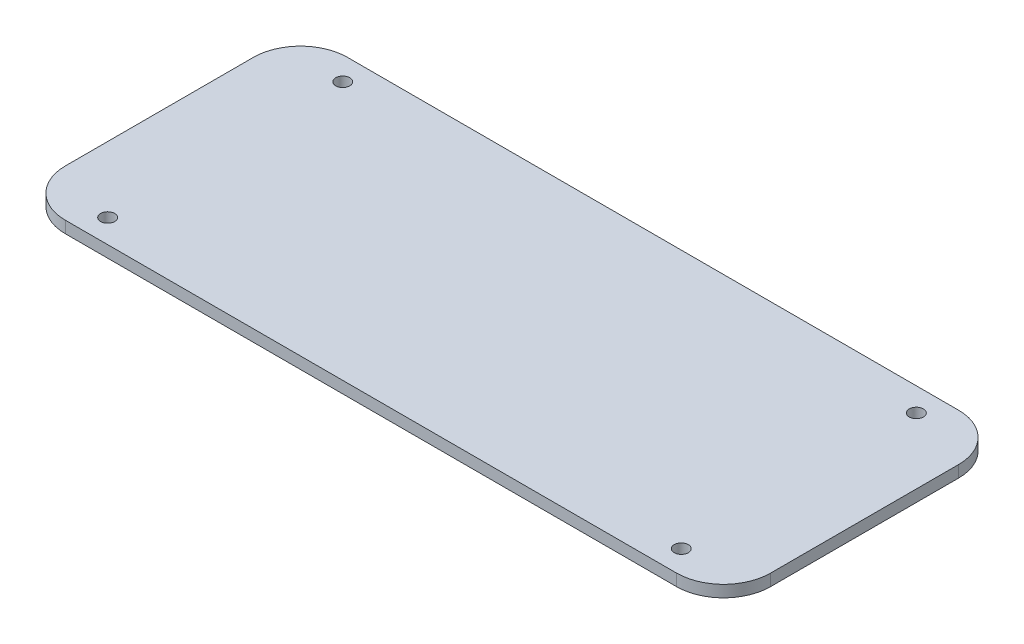
ISO-10303-21;
HEADER;
FILE_DESCRIPTION(('STEP AP214'),'2;1');
FILE_NAME('part.step','',(''),(''),'','','');
FILE_SCHEMA(('AUTOMOTIVE_DESIGN { 1 0 10303 214 1 1 1 1 }'));
ENDSEC;
DATA;
#1=APPLICATION_CONTEXT('core data for automotive mechanical design processes');
#2=APPLICATION_PROTOCOL_DEFINITION('international standard','automotive_design',2000,#1);
#3=PRODUCT_CONTEXT('',#1,'mechanical');
#4=PRODUCT('Part','Part','',(#3));
#5=PRODUCT_RELATED_PRODUCT_CATEGORY('part','',(#4));
#6=PRODUCT_DEFINITION_FORMATION('','',#4);
#7=PRODUCT_DEFINITION_CONTEXT('part definition',#1,'design');
#8=PRODUCT_DEFINITION('design','',#6,#7);
#9=PRODUCT_DEFINITION_SHAPE('','',#8);
#10=(LENGTH_UNIT() NAMED_UNIT(*) SI_UNIT(.MILLI.,.METRE.));
#11=(NAMED_UNIT(*) PLANE_ANGLE_UNIT() SI_UNIT($,.RADIAN.));
#12=(NAMED_UNIT(*) SI_UNIT($,.STERADIAN.) SOLID_ANGLE_UNIT());
#13=UNCERTAINTY_MEASURE_WITH_UNIT(LENGTH_MEASURE(1.E-05),#10,'distance_accuracy_value','');
#14=(GEOMETRIC_REPRESENTATION_CONTEXT(3) GLOBAL_UNCERTAINTY_ASSIGNED_CONTEXT((#13)) GLOBAL_UNIT_ASSIGNED_CONTEXT((#10,
#11,#12)) REPRESENTATION_CONTEXT('',''));
#15=CARTESIAN_POINT('',(0.,0.,0.));
#16=DIRECTION('',(0.,0.,1.));
#17=DIRECTION('',(1.,0.,0.));
#18=AXIS2_PLACEMENT_3D('',#15,#16,#17);
#19=CARTESIAN_POINT('',(10.,2.5,-50.));
#20=DIRECTION('',(0.,-1.,0.));
#21=DIRECTION('',(0.,0.,-1.));
#22=AXIS2_PLACEMENT_3D('',#19,#20,#21);
#23=CYLINDRICAL_SURFACE('',#22,10.);
#24=CARTESIAN_POINT('',(10.,0.,-50.));
#25=DIRECTION('',(0.,1.,0.));
#26=DIRECTION('',(0.,0.,1.));
#27=AXIS2_PLACEMENT_3D('',#24,#25,#26);
#28=CIRCLE('',#27,10.);
#29=CARTESIAN_POINT('',(10.,0.,-60.));
#30=VERTEX_POINT('',#29);
#31=CARTESIAN_POINT('',(0.,0.,-50.));
#32=VERTEX_POINT('',#31);
#33=EDGE_CURVE('E132',#30,#32,#28,.T.);
#34=ORIENTED_EDGE('',*,*,#33,.T.);
#35=DIRECTION('',(0.,-1.,0.));
#36=VECTOR('',#35,1.);
#37=CARTESIAN_POINT('',(0.,2.5,-50.));
#38=LINE('',#37,#36);
#39=CARTESIAN_POINT('',(0.,2.5,-50.));
#40=VERTEX_POINT('',#39);
#41=EDGE_CURVE('E11',#40,#32,#38,.T.);
#42=ORIENTED_EDGE('',*,*,#41,.F.);
#43=CARTESIAN_POINT('',(10.,2.5,-50.));
#44=DIRECTION('',(0.,1.,0.));
#45=DIRECTION('',(0.,0.,1.));
#46=AXIS2_PLACEMENT_3D('',#43,#44,#45);
#47=CIRCLE('',#46,10.);
#48=CARTESIAN_POINT('',(10.,2.5,-60.));
#49=VERTEX_POINT('',#48);
#50=EDGE_CURVE('E147',#49,#40,#47,.T.);
#51=ORIENTED_EDGE('',*,*,#50,.F.);
#52=DIRECTION('',(0.,-1.,0.));
#53=VECTOR('',#52,1.);
#54=CARTESIAN_POINT('',(10.,2.5,-60.));
#55=LINE('',#54,#53);
#56=EDGE_CURVE('E128',#49,#30,#55,.T.);
#57=ORIENTED_EDGE('',*,*,#56,.T.);
#58=EDGE_LOOP('',(#34,#42,#51,#57));
#59=FACE_BOUND('',#58,.T.);
#60=ADVANCED_FACE('F36',(#59),#23,.T.);
#61=CARTESIAN_POINT('',(0.,2.5,-10.0000000000001));
#62=DIRECTION('',(1.,0.,0.));
#63=DIRECTION('',(0.,0.,-1.));
#64=AXIS2_PLACEMENT_3D('',#61,#62,#63);
#65=PLANE('',#64);
#66=DIRECTION('',(0.,0.,1.));
#67=VECTOR('',#66,1.);
#68=CARTESIAN_POINT('',(0.,0.,-10.0000000000001));
#69=LINE('',#68,#67);
#70=CARTESIAN_POINT('',(0.,0.,-10.0000000000001));
#71=VERTEX_POINT('',#70);
#72=EDGE_CURVE('E135',#32,#71,#69,.T.);
#73=ORIENTED_EDGE('',*,*,#72,.T.);
#74=DIRECTION('',(0.,-1.,0.));
#75=VECTOR('',#74,1.);
#76=CARTESIAN_POINT('',(0.,2.5,-10.0000000000001));
#77=LINE('',#76,#75);
#78=CARTESIAN_POINT('',(0.,2.5,-10.0000000000001));
#79=VERTEX_POINT('',#78);
#80=EDGE_CURVE('E44',#79,#71,#77,.T.);
#81=ORIENTED_EDGE('',*,*,#80,.F.);
#82=DIRECTION('',(0.,0.,1.));
#83=VECTOR('',#82,1.);
#84=CARTESIAN_POINT('',(0.,2.5,-10.0000000000001));
#85=LINE('',#84,#83);
#86=EDGE_CURVE('E95',#40,#79,#85,.T.);
#87=ORIENTED_EDGE('',*,*,#86,.F.);
#88=ORIENTED_EDGE('',*,*,#41,.T.);
#89=EDGE_LOOP('',(#73,#81,#87,#88));
#90=FACE_BOUND('',#89,.T.);
#91=ADVANCED_FACE('F237',(#90),#65,.F.);
#92=CARTESIAN_POINT('',(10.,2.5,-10.));
#93=DIRECTION('',(0.,-1.,0.));
#94=DIRECTION('',(0.,0.,-1.));
#95=AXIS2_PLACEMENT_3D('',#92,#93,#94);
#96=CYLINDRICAL_SURFACE('',#95,10.);
#97=CARTESIAN_POINT('',(10.,0.,-10.));
#98=DIRECTION('',(0.,1.,0.));
#99=DIRECTION('',(0.,0.,1.));
#100=AXIS2_PLACEMENT_3D('',#97,#98,#99);
#101=CIRCLE('',#100,10.);
#102=CARTESIAN_POINT('',(10.0000000000001,0.,0.));
#103=VERTEX_POINT('',#102);
#104=EDGE_CURVE('E138',#71,#103,#101,.T.);
#105=ORIENTED_EDGE('',*,*,#104,.T.);
#106=DIRECTION('',(0.,-1.,0.));
#107=VECTOR('',#106,1.);
#108=CARTESIAN_POINT('',(10.0000000000001,2.5,0.));
#109=LINE('',#108,#107);
#110=CARTESIAN_POINT('',(10.0000000000001,2.5,0.));
#111=VERTEX_POINT('',#110);
#112=EDGE_CURVE('E154',#111,#103,#109,.T.);
#113=ORIENTED_EDGE('',*,*,#112,.F.);
#114=CARTESIAN_POINT('',(10.,2.5,-10.));
#115=DIRECTION('',(0.,1.,0.));
#116=DIRECTION('',(0.,0.,1.));
#117=AXIS2_PLACEMENT_3D('',#114,#115,#116);
#118=CIRCLE('',#117,10.);
#119=EDGE_CURVE('E162',#79,#111,#118,.T.);
#120=ORIENTED_EDGE('',*,*,#119,.F.);
#121=ORIENTED_EDGE('',*,*,#80,.T.);
#122=EDGE_LOOP('',(#105,#113,#120,#121));
#123=FACE_BOUND('',#122,.T.);
#124=ADVANCED_FACE('F160',(#123),#96,.T.);
#125=CARTESIAN_POINT('',(10.0000000000001,2.5,0.));
#126=DIRECTION('',(0.,0.,-1.));
#127=DIRECTION('',(-1.,0.,0.));
#128=AXIS2_PLACEMENT_3D('',#125,#126,#127);
#129=PLANE('',#128);
#130=DIRECTION('',(1.,0.,0.));
#131=VECTOR('',#130,1.);
#132=CARTESIAN_POINT('',(10.0000000000001,0.,0.));
#133=LINE('',#132,#131);
#134=CARTESIAN_POINT('',(140.,0.,0.));
#135=VERTEX_POINT('',#134);
#136=EDGE_CURVE('E140',#103,#135,#133,.T.);
#137=ORIENTED_EDGE('',*,*,#136,.T.);
#138=DIRECTION('',(0.,-1.,0.));
#139=VECTOR('',#138,1.);
#140=CARTESIAN_POINT('',(140.,2.5,0.));
#141=LINE('',#140,#139);
#142=CARTESIAN_POINT('',(140.,2.5,0.));
#143=VERTEX_POINT('',#142);
#144=EDGE_CURVE('E151',#143,#135,#141,.T.);
#145=ORIENTED_EDGE('',*,*,#144,.F.);
#146=DIRECTION('',(1.,0.,0.));
#147=VECTOR('',#146,1.);
#148=CARTESIAN_POINT('',(10.0000000000001,2.5,0.));
#149=LINE('',#148,#147);
#150=EDGE_CURVE('E174',#111,#143,#149,.T.);
#151=ORIENTED_EDGE('',*,*,#150,.F.);
#152=ORIENTED_EDGE('',*,*,#112,.T.);
#153=EDGE_LOOP('',(#137,#145,#151,#152));
#154=FACE_BOUND('',#153,.T.);
#155=ADVANCED_FACE('F170',(#154),#129,.F.);
#156=CARTESIAN_POINT('',(140.,2.5,-10.));
#157=DIRECTION('',(0.,-1.,0.));
#158=DIRECTION('',(0.,0.,-1.));
#159=AXIS2_PLACEMENT_3D('',#156,#157,#158);
#160=CYLINDRICAL_SURFACE('',#159,10.);
#161=CARTESIAN_POINT('',(140.,0.,-10.));
#162=DIRECTION('',(0.,1.,0.));
#163=DIRECTION('',(0.,0.,-1.));
#164=AXIS2_PLACEMENT_3D('',#161,#162,#163);
#165=CIRCLE('',#164,10.);
#166=CARTESIAN_POINT('',(150.,0.,-10.));
#167=VERTEX_POINT('',#166);
#168=EDGE_CURVE('E142',#135,#167,#165,.T.);
#169=ORIENTED_EDGE('',*,*,#168,.T.);
#170=DIRECTION('',(0.,-1.,0.));
#171=VECTOR('',#170,1.);
#172=CARTESIAN_POINT('',(150.,2.5,-10.));
#173=LINE('',#172,#171);
#174=CARTESIAN_POINT('',(150.,2.5,-10.));
#175=VERTEX_POINT('',#174);
#176=EDGE_CURVE('E123',#175,#167,#173,.T.);
#177=ORIENTED_EDGE('',*,*,#176,.F.);
#178=CARTESIAN_POINT('',(140.,2.5,-10.));
#179=DIRECTION('',(0.,1.,0.));
#180=DIRECTION('',(0.,0.,-1.));
#181=AXIS2_PLACEMENT_3D('',#178,#179,#180);
#182=CIRCLE('',#181,10.);
#183=EDGE_CURVE('E114',#143,#175,#182,.T.);
#184=ORIENTED_EDGE('',*,*,#183,.F.);
#185=ORIENTED_EDGE('',*,*,#144,.T.);
#186=EDGE_LOOP('',(#169,#177,#184,#185));
#187=FACE_BOUND('',#186,.T.);
#188=ADVANCED_FACE('F173',(#187),#160,.T.);
#189=CARTESIAN_POINT('',(150.,2.5,-10.));
#190=DIRECTION('',(-1.,0.,0.));
#191=DIRECTION('',(0.,0.,1.));
#192=AXIS2_PLACEMENT_3D('',#189,#190,#191);
#193=PLANE('',#192);
#194=DIRECTION('',(0.,0.,-1.));
#195=VECTOR('',#194,1.);
#196=CARTESIAN_POINT('',(150.,0.,-10.));
#197=LINE('',#196,#195);
#198=CARTESIAN_POINT('',(150.,0.,-50.));
#199=VERTEX_POINT('',#198);
#200=EDGE_CURVE('E122',#167,#199,#197,.T.);
#201=ORIENTED_EDGE('',*,*,#200,.T.);
#202=DIRECTION('',(0.,-1.,0.));
#203=VECTOR('',#202,1.);
#204=CARTESIAN_POINT('',(150.,2.5,-50.));
#205=LINE('',#204,#203);
#206=CARTESIAN_POINT('',(150.,2.5,-50.));
#207=VERTEX_POINT('',#206);
#208=EDGE_CURVE('E119',#207,#199,#205,.T.);
#209=ORIENTED_EDGE('',*,*,#208,.F.);
#210=DIRECTION('',(0.,0.,-1.));
#211=VECTOR('',#210,1.);
#212=CARTESIAN_POINT('',(150.,2.5,-10.));
#213=LINE('',#212,#211);
#214=EDGE_CURVE('E108',#175,#207,#213,.T.);
#215=ORIENTED_EDGE('',*,*,#214,.F.);
#216=ORIENTED_EDGE('',*,*,#176,.T.);
#217=EDGE_LOOP('',(#201,#209,#215,#216));
#218=FACE_BOUND('',#217,.T.);
#219=ADVANCED_FACE('F120',(#218),#193,.F.);
#220=CARTESIAN_POINT('',(140.,2.5,-50.));
#221=DIRECTION('',(0.,-1.,0.));
#222=DIRECTION('',(0.,0.,-1.));
#223=AXIS2_PLACEMENT_3D('',#220,#221,#222);
#224=CYLINDRICAL_SURFACE('',#223,10.);
#225=CARTESIAN_POINT('',(140.,0.,-50.));
#226=DIRECTION('',(0.,1.,0.));
#227=DIRECTION('',(0.,0.,-1.));
#228=AXIS2_PLACEMENT_3D('',#225,#226,#227);
#229=CIRCLE('',#228,10.);
#230=CARTESIAN_POINT('',(140.,0.,-60.));
#231=VERTEX_POINT('',#230);
#232=EDGE_CURVE('E81',#199,#231,#229,.T.);
#233=ORIENTED_EDGE('',*,*,#232,.T.);
#234=DIRECTION('',(0.,-1.,0.));
#235=VECTOR('',#234,1.);
#236=CARTESIAN_POINT('',(140.,2.5,-60.));
#237=LINE('',#236,#235);
#238=CARTESIAN_POINT('',(140.,2.5,-60.));
#239=VERTEX_POINT('',#238);
#240=EDGE_CURVE('E124',#239,#231,#237,.T.);
#241=ORIENTED_EDGE('',*,*,#240,.F.);
#242=CARTESIAN_POINT('',(140.,2.5,-50.));
#243=DIRECTION('',(0.,1.,0.));
#244=DIRECTION('',(0.,0.,-1.));
#245=AXIS2_PLACEMENT_3D('',#242,#243,#244);
#246=CIRCLE('',#245,10.);
#247=EDGE_CURVE('E112',#207,#239,#246,.T.);
#248=ORIENTED_EDGE('',*,*,#247,.F.);
#249=ORIENTED_EDGE('',*,*,#208,.T.);
#250=EDGE_LOOP('',(#233,#241,#248,#249));
#251=FACE_BOUND('',#250,.T.);
#252=ADVANCED_FACE('F126',(#251),#224,.T.);
#253=CARTESIAN_POINT('',(10.,2.5,-60.));
#254=DIRECTION('',(0.,0.,1.));
#255=DIRECTION('',(1.,0.,0.));
#256=AXIS2_PLACEMENT_3D('',#253,#254,#255);
#257=PLANE('',#256);
#258=DIRECTION('',(-1.,0.,0.));
#259=VECTOR('',#258,1.);
#260=CARTESIAN_POINT('',(10.,0.,-60.));
#261=LINE('',#260,#259);
#262=EDGE_CURVE('E87',#231,#30,#261,.T.);
#263=ORIENTED_EDGE('',*,*,#262,.T.);
#264=ORIENTED_EDGE('',*,*,#56,.F.);
#265=DIRECTION('',(-1.,0.,0.));
#266=VECTOR('',#265,1.);
#267=CARTESIAN_POINT('',(10.,2.5,-60.));
#268=LINE('',#267,#266);
#269=EDGE_CURVE('E52',#239,#49,#268,.T.);
#270=ORIENTED_EDGE('',*,*,#269,.F.);
#271=ORIENTED_EDGE('',*,*,#240,.T.);
#272=EDGE_LOOP('',(#263,#264,#270,#271));
#273=FACE_BOUND('',#272,.T.);
#274=ADVANCED_FACE('F215',(#273),#257,.F.);
#275=CARTESIAN_POINT('',(10.,2.5,-50.));
#276=DIRECTION('',(0.,1.,0.));
#277=DIRECTION('',(0.,0.,1.));
#278=AXIS2_PLACEMENT_3D('',#275,#276,#277);
#279=PLANE('',#278);
#280=CARTESIAN_POINT('',(136.,2.5,-55.));
#281=DIRECTION('',(0.,1.,0.));
#282=DIRECTION('',(0.,0.,-1.));
#283=AXIS2_PLACEMENT_3D('',#280,#281,#282);
#284=CIRCLE('',#283,1.5);
#285=CARTESIAN_POINT('',(136.,2.5,-56.5));
#286=VERTEX_POINT('',#285);
#287=EDGE_CURVE('E198',#286,#286,#284,.T.);
#288=ORIENTED_EDGE('',*,*,#287,.F.);
#289=EDGE_LOOP('',(#288));
#290=FACE_BOUND('',#289,.T.);
#291=CARTESIAN_POINT('',(136.,2.5,-5.));
#292=DIRECTION('',(0.,1.,0.));
#293=DIRECTION('',(0.,0.,-1.));
#294=AXIS2_PLACEMENT_3D('',#291,#292,#293);
#295=CIRCLE('',#294,1.5);
#296=CARTESIAN_POINT('',(136.,2.5,-6.49999999999999));
#297=VERTEX_POINT('',#296);
#298=EDGE_CURVE('E192',#297,#297,#295,.T.);
#299=ORIENTED_EDGE('',*,*,#298,.F.);
#300=EDGE_LOOP('',(#299));
#301=FACE_BOUND('',#300,.T.);
#302=CARTESIAN_POINT('',(14.,2.5,-55.));
#303=DIRECTION('',(0.,1.,0.));
#304=DIRECTION('',(0.,0.,1.));
#305=AXIS2_PLACEMENT_3D('',#302,#303,#304);
#306=CIRCLE('',#305,1.5);
#307=CARTESIAN_POINT('',(14.,2.5,-53.5));
#308=VERTEX_POINT('',#307);
#309=EDGE_CURVE('E186',#308,#308,#306,.T.);
#310=ORIENTED_EDGE('',*,*,#309,.F.);
#311=EDGE_LOOP('',(#310));
#312=FACE_BOUND('',#311,.T.);
#313=CARTESIAN_POINT('',(14.,2.5,-5.));
#314=DIRECTION('',(0.,1.,0.));
#315=DIRECTION('',(0.,0.,1.));
#316=AXIS2_PLACEMENT_3D('',#313,#314,#315);
#317=CIRCLE('',#316,1.5);
#318=CARTESIAN_POINT('',(14.,2.5,-3.5));
#319=VERTEX_POINT('',#318);
#320=EDGE_CURVE('E180',#319,#319,#317,.T.);
#321=ORIENTED_EDGE('',*,*,#320,.F.);
#322=EDGE_LOOP('',(#321));
#323=FACE_BOUND('',#322,.T.);
#324=ORIENTED_EDGE('',*,*,#50,.T.);
#325=ORIENTED_EDGE('',*,*,#86,.T.);
#326=ORIENTED_EDGE('',*,*,#119,.T.);
#327=ORIENTED_EDGE('',*,*,#150,.T.);
#328=ORIENTED_EDGE('',*,*,#183,.T.);
#329=ORIENTED_EDGE('',*,*,#214,.T.);
#330=ORIENTED_EDGE('',*,*,#247,.T.);
#331=ORIENTED_EDGE('',*,*,#269,.T.);
#332=EDGE_LOOP('',(#324,#325,#326,#327,#328,#329,#330,#331));
#333=FACE_BOUND('',#332,.T.);
#334=ADVANCED_FACE('F110',(#290,#301,#312,#323,#333),#279,.T.);
#335=CARTESIAN_POINT('',(10.,0.,-50.));
#336=DIRECTION('',(0.,1.,0.));
#337=DIRECTION('',(0.,0.,1.));
#338=AXIS2_PLACEMENT_3D('',#335,#336,#337);
#339=PLANE('',#338);
#340=CARTESIAN_POINT('',(136.,0.,-55.));
#341=DIRECTION('',(0.,1.,0.));
#342=DIRECTION('',(0.,0.,-1.));
#343=AXIS2_PLACEMENT_3D('',#340,#341,#342);
#344=CIRCLE('',#343,1.5);
#345=CARTESIAN_POINT('',(136.,0.,-56.5));
#346=VERTEX_POINT('',#345);
#347=EDGE_CURVE('E195',#346,#346,#344,.T.);
#348=ORIENTED_EDGE('',*,*,#347,.T.);
#349=EDGE_LOOP('',(#348));
#350=FACE_BOUND('',#349,.T.);
#351=CARTESIAN_POINT('',(136.,0.,-5.));
#352=DIRECTION('',(0.,1.,0.));
#353=DIRECTION('',(0.,0.,-1.));
#354=AXIS2_PLACEMENT_3D('',#351,#352,#353);
#355=CIRCLE('',#354,1.5);
#356=CARTESIAN_POINT('',(136.,0.,-6.49999999999999));
#357=VERTEX_POINT('',#356);
#358=EDGE_CURVE('E189',#357,#357,#355,.T.);
#359=ORIENTED_EDGE('',*,*,#358,.T.);
#360=EDGE_LOOP('',(#359));
#361=FACE_BOUND('',#360,.T.);
#362=CARTESIAN_POINT('',(14.,0.,-55.));
#363=DIRECTION('',(0.,1.,0.));
#364=DIRECTION('',(0.,0.,1.));
#365=AXIS2_PLACEMENT_3D('',#362,#363,#364);
#366=CIRCLE('',#365,1.5);
#367=CARTESIAN_POINT('',(14.,0.,-53.5));
#368=VERTEX_POINT('',#367);
#369=EDGE_CURVE('E183',#368,#368,#366,.T.);
#370=ORIENTED_EDGE('',*,*,#369,.T.);
#371=EDGE_LOOP('',(#370));
#372=FACE_BOUND('',#371,.T.);
#373=CARTESIAN_POINT('',(14.,0.,-5.));
#374=DIRECTION('',(0.,1.,0.));
#375=DIRECTION('',(0.,0.,1.));
#376=AXIS2_PLACEMENT_3D('',#373,#374,#375);
#377=CIRCLE('',#376,1.5);
#378=CARTESIAN_POINT('',(14.,0.,-3.5));
#379=VERTEX_POINT('',#378);
#380=EDGE_CURVE('E136',#379,#379,#377,.T.);
#381=ORIENTED_EDGE('',*,*,#380,.T.);
#382=EDGE_LOOP('',(#381));
#383=FACE_BOUND('',#382,.T.);
#384=ORIENTED_EDGE('',*,*,#33,.F.);
#385=ORIENTED_EDGE('',*,*,#262,.F.);
#386=ORIENTED_EDGE('',*,*,#232,.F.);
#387=ORIENTED_EDGE('',*,*,#200,.F.);
#388=ORIENTED_EDGE('',*,*,#168,.F.);
#389=ORIENTED_EDGE('',*,*,#136,.F.);
#390=ORIENTED_EDGE('',*,*,#104,.F.);
#391=ORIENTED_EDGE('',*,*,#72,.F.);
#392=EDGE_LOOP('',(#384,#385,#386,#387,#388,#389,#390,#391));
#393=FACE_BOUND('',#392,.T.);
#394=ADVANCED_FACE('F166',(#350,#361,#372,#383,#393),#339,.F.);
#395=CARTESIAN_POINT('',(14.,0.,-5.));
#396=DIRECTION('',(0.,1.,0.));
#397=DIRECTION('',(0.,0.,1.));
#398=AXIS2_PLACEMENT_3D('',#395,#396,#397);
#399=CYLINDRICAL_SURFACE('',#398,1.5);
#400=ORIENTED_EDGE('',*,*,#380,.F.);
#401=EDGE_LOOP('',(#400));
#402=FACE_BOUND('',#401,.T.);
#403=ORIENTED_EDGE('',*,*,#320,.T.);
#404=EDGE_LOOP('',(#403));
#405=FACE_BOUND('',#404,.T.);
#406=ADVANCED_FACE('F223',(#402,#405),#399,.F.);
#407=CARTESIAN_POINT('',(14.,0.,-55.));
#408=DIRECTION('',(0.,1.,0.));
#409=DIRECTION('',(0.,0.,1.));
#410=AXIS2_PLACEMENT_3D('',#407,#408,#409);
#411=CYLINDRICAL_SURFACE('',#410,1.5);
#412=ORIENTED_EDGE('',*,*,#369,.F.);
#413=EDGE_LOOP('',(#412));
#414=FACE_BOUND('',#413,.T.);
#415=ORIENTED_EDGE('',*,*,#309,.T.);
#416=EDGE_LOOP('',(#415));
#417=FACE_BOUND('',#416,.T.);
#418=ADVANCED_FACE('F225',(#414,#417),#411,.F.);
#419=CARTESIAN_POINT('',(136.,0.,-5.));
#420=DIRECTION('',(0.,1.,0.));
#421=DIRECTION('',(0.,0.,1.));
#422=AXIS2_PLACEMENT_3D('',#419,#420,#421);
#423=CYLINDRICAL_SURFACE('',#422,1.5);
#424=ORIENTED_EDGE('',*,*,#358,.F.);
#425=EDGE_LOOP('',(#424));
#426=FACE_BOUND('',#425,.T.);
#427=ORIENTED_EDGE('',*,*,#298,.T.);
#428=EDGE_LOOP('',(#427));
#429=FACE_BOUND('',#428,.T.);
#430=ADVANCED_FACE('F209',(#426,#429),#423,.F.);
#431=CARTESIAN_POINT('',(136.,0.,-55.));
#432=DIRECTION('',(0.,1.,0.));
#433=DIRECTION('',(0.,0.,1.));
#434=AXIS2_PLACEMENT_3D('',#431,#432,#433);
#435=CYLINDRICAL_SURFACE('',#434,1.5);
#436=ORIENTED_EDGE('',*,*,#347,.F.);
#437=EDGE_LOOP('',(#436));
#438=FACE_BOUND('',#437,.T.);
#439=ORIENTED_EDGE('',*,*,#287,.T.);
#440=EDGE_LOOP('',(#439));
#441=FACE_BOUND('',#440,.T.);
#442=ADVANCED_FACE('F206',(#438,#441),#435,.F.);
#443=CLOSED_SHELL('',(#60,#91,#124,#155,#188,#219,#252,#274,#334,#394,#406,#418,#430,#442));
#444=MANIFOLD_SOLID_BREP('B2',#443);
#445=ADVANCED_BREP_SHAPE_REPRESENTATION('',(#18,#444),#14);
#446=SHAPE_DEFINITION_REPRESENTATION(#9,#445);
ENDSEC;
END-ISO-10303-21;
